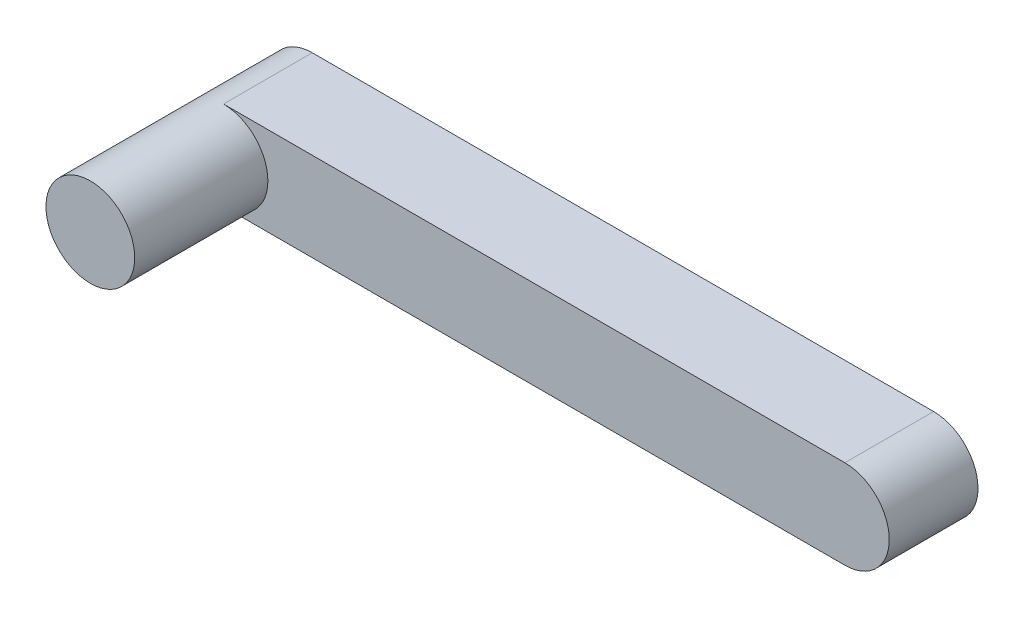
ISO-10303-21;
HEADER;
FILE_DESCRIPTION(('STEP AP214'),'2;1');
FILE_NAME('part.step','',(''),(''),'','','');
FILE_SCHEMA(('AUTOMOTIVE_DESIGN { 1 0 10303 214 1 1 1 1 }'));
ENDSEC;
DATA;
#1=APPLICATION_CONTEXT('core data for automotive mechanical design processes');
#2=APPLICATION_PROTOCOL_DEFINITION('international standard','automotive_design',2000,#1);
#3=PRODUCT_CONTEXT('',#1,'mechanical');
#4=PRODUCT('Part','Part','',(#3));
#5=PRODUCT_RELATED_PRODUCT_CATEGORY('part','',(#4));
#6=PRODUCT_DEFINITION_FORMATION('','',#4);
#7=PRODUCT_DEFINITION_CONTEXT('part definition',#1,'design');
#8=PRODUCT_DEFINITION('design','',#6,#7);
#9=PRODUCT_DEFINITION_SHAPE('','',#8);
#10=(LENGTH_UNIT() NAMED_UNIT(*) SI_UNIT(.MILLI.,.METRE.));
#11=(NAMED_UNIT(*) PLANE_ANGLE_UNIT() SI_UNIT($,.RADIAN.));
#12=(NAMED_UNIT(*) SI_UNIT($,.STERADIAN.) SOLID_ANGLE_UNIT());
#13=UNCERTAINTY_MEASURE_WITH_UNIT(LENGTH_MEASURE(1.E-05),#10,'distance_accuracy_value','');
#14=(GEOMETRIC_REPRESENTATION_CONTEXT(3) GLOBAL_UNCERTAINTY_ASSIGNED_CONTEXT((#13)) GLOBAL_UNIT_ASSIGNED_CONTEXT((#10,
#11,#12)) REPRESENTATION_CONTEXT('',''));
#15=CARTESIAN_POINT('',(0.,0.,0.));
#16=DIRECTION('',(0.,0.,1.));
#17=DIRECTION('',(1.,0.,0.));
#18=AXIS2_PLACEMENT_3D('',#15,#16,#17);
#19=CARTESIAN_POINT('',(0.,0.,25.4));
#20=DIRECTION('',(0.,0.,-1.));
#21=DIRECTION('',(-1.,0.,0.));
#22=AXIS2_PLACEMENT_3D('',#19,#20,#21);
#23=CYLINDRICAL_SURFACE('',#22,12.7);
#24=CARTESIAN_POINT('',(0.,0.,0.));
#25=DIRECTION('',(0.,0.,1.));
#26=DIRECTION('',(1.,0.,0.));
#27=AXIS2_PLACEMENT_3D('',#24,#25,#26);
#28=CIRCLE('',#27,12.7);
#29=CARTESIAN_POINT('',(0.,-12.7,0.));
#30=VERTEX_POINT('',#29);
#31=CARTESIAN_POINT('',(0.,12.7,0.));
#32=VERTEX_POINT('',#31);
#33=EDGE_CURVE('E118',#30,#32,#28,.T.);
#34=ORIENTED_EDGE('',*,*,#33,.T.);
#35=DIRECTION('',(0.,0.,-1.));
#36=VECTOR('',#35,1.);
#37=CARTESIAN_POINT('',(0.,12.7,25.4));
#38=LINE('',#37,#36);
#39=CARTESIAN_POINT('',(0.,12.7,25.4));
#40=VERTEX_POINT('',#39);
#41=EDGE_CURVE('E48',#40,#32,#38,.T.);
#42=ORIENTED_EDGE('',*,*,#41,.F.);
#43=CARTESIAN_POINT('',(0.,0.,25.4));
#44=DIRECTION('',(0.,0.,1.));
#45=DIRECTION('',(1.,0.,0.));
#46=AXIS2_PLACEMENT_3D('',#43,#44,#45);
#47=CIRCLE('',#46,12.7);
#48=CARTESIAN_POINT('',(0.,-12.7,25.4));
#49=VERTEX_POINT('',#48);
#50=EDGE_CURVE('E102',#49,#40,#47,.T.);
#51=ORIENTED_EDGE('',*,*,#50,.F.);
#52=DIRECTION('',(0.,0.,-1.));
#53=VECTOR('',#52,1.);
#54=CARTESIAN_POINT('',(0.,-12.7,25.4));
#55=LINE('',#54,#53);
#56=EDGE_CURVE('E109',#49,#30,#55,.T.);
#57=ORIENTED_EDGE('',*,*,#56,.T.);
#58=EDGE_LOOP('',(#34,#42,#51,#57));
#59=FACE_BOUND('',#58,.T.);
#60=ADVANCED_FACE('F45',(#59),#23,.T.);
#61=CARTESIAN_POINT('',(0.,12.7,25.4));
#62=DIRECTION('',(0.,-1.,0.));
#63=DIRECTION('',(1.,0.,0.));
#64=AXIS2_PLACEMENT_3D('',#61,#62,#63);
#65=PLANE('',#64);
#66=DIRECTION('',(-1.,0.,0.));
#67=VECTOR('',#66,1.);
#68=CARTESIAN_POINT('',(0.,12.7,0.));
#69=LINE('',#68,#67);
#70=CARTESIAN_POINT('',(-177.8,12.6999999999999,0.));
#71=VERTEX_POINT('',#70);
#72=EDGE_CURVE('E97',#32,#71,#69,.T.);
#73=ORIENTED_EDGE('',*,*,#72,.T.);
#74=DIRECTION('',(0.,0.,-1.));
#75=VECTOR('',#74,1.);
#76=CARTESIAN_POINT('',(-177.8,12.6999999999999,25.4));
#77=LINE('',#76,#75);
#78=CARTESIAN_POINT('',(-177.8,12.6999999999999,25.4));
#79=VERTEX_POINT('',#78);
#80=EDGE_CURVE('E95',#79,#71,#77,.T.);
#81=ORIENTED_EDGE('',*,*,#80,.F.);
#82=DIRECTION('',(-1.,0.,0.));
#83=VECTOR('',#82,1.);
#84=CARTESIAN_POINT('',(0.,12.7,25.4));
#85=LINE('',#84,#83);
#86=EDGE_CURVE('E93',#40,#79,#85,.T.);
#87=ORIENTED_EDGE('',*,*,#86,.F.);
#88=ORIENTED_EDGE('',*,*,#41,.T.);
#89=EDGE_LOOP('',(#73,#81,#87,#88));
#90=FACE_BOUND('',#89,.T.);
#91=ADVANCED_FACE('F96',(#90),#65,.F.);
#92=CARTESIAN_POINT('',(-177.8,0.,25.4));
#93=DIRECTION('',(0.,0.,-1.));
#94=DIRECTION('',(-1.,0.,0.));
#95=AXIS2_PLACEMENT_3D('',#92,#93,#94);
#96=CYLINDRICAL_SURFACE('',#95,12.7);
#97=CARTESIAN_POINT('',(-177.8,0.,0.));
#98=DIRECTION('',(0.,0.,1.));
#99=DIRECTION('',(1.,0.,0.));
#100=AXIS2_PLACEMENT_3D('',#97,#98,#99);
#101=CIRCLE('',#100,12.7);
#102=CARTESIAN_POINT('',(-177.8,-12.7,0.));
#103=VERTEX_POINT('',#102);
#104=EDGE_CURVE('E81',#71,#103,#101,.T.);
#105=ORIENTED_EDGE('',*,*,#104,.T.);
#106=DIRECTION('',(0.,0.,-1.));
#107=VECTOR('',#106,1.);
#108=CARTESIAN_POINT('',(-177.8,-12.7,25.4));
#109=LINE('',#108,#107);
#110=CARTESIAN_POINT('',(-177.8,-12.7,25.4));
#111=VERTEX_POINT('',#110);
#112=EDGE_CURVE('E99',#111,#103,#109,.T.);
#113=ORIENTED_EDGE('',*,*,#112,.F.);
#114=CARTESIAN_POINT('',(-177.8,0.,25.4));
#115=DIRECTION('',(0.,0.,1.));
#116=DIRECTION('',(1.,0.,0.));
#117=AXIS2_PLACEMENT_3D('',#114,#115,#116);
#118=CIRCLE('',#117,12.7);
#119=EDGE_CURVE('E11',#111,#79,#118,.T.);
#120=ORIENTED_EDGE('',*,*,#119,.T.);
#121=ORIENTED_EDGE('',*,*,#80,.T.);
#122=EDGE_LOOP('',(#105,#113,#120,#121));
#123=FACE_BOUND('',#122,.T.);
#124=CARTESIAN_POINT('',(-177.8,0.,63.5));
#125=DIRECTION('',(0.,0.,1.));
#126=DIRECTION('',(1.,0.,0.));
#127=AXIS2_PLACEMENT_3D('',#124,#125,#126);
#128=CIRCLE('',#127,12.7);
#129=CARTESIAN_POINT('',(-165.1,0.,63.5));
#130=VERTEX_POINT('',#129);
#131=EDGE_CURVE('E122',#130,#130,#128,.T.);
#132=ORIENTED_EDGE('',*,*,#131,.F.);
#133=EDGE_LOOP('',(#132));
#134=FACE_BOUND('',#133,.T.);
#135=ADVANCED_FACE('F106',(#123,#134),#96,.T.);
#136=CARTESIAN_POINT('',(0.,-12.7,25.4));
#137=DIRECTION('',(0.,1.,0.));
#138=DIRECTION('',(-1.,0.,0.));
#139=AXIS2_PLACEMENT_3D('',#136,#137,#138);
#140=PLANE('',#139);
#141=DIRECTION('',(1.,0.,0.));
#142=VECTOR('',#141,1.);
#143=CARTESIAN_POINT('',(0.,-12.7,0.));
#144=LINE('',#143,#142);
#145=EDGE_CURVE('E86',#103,#30,#144,.T.);
#146=ORIENTED_EDGE('',*,*,#145,.T.);
#147=ORIENTED_EDGE('',*,*,#56,.F.);
#148=DIRECTION('',(1.,0.,0.));
#149=VECTOR('',#148,1.);
#150=CARTESIAN_POINT('',(0.,-12.7,25.4));
#151=LINE('',#150,#149);
#152=EDGE_CURVE('E63',#111,#49,#151,.T.);
#153=ORIENTED_EDGE('',*,*,#152,.F.);
#154=ORIENTED_EDGE('',*,*,#112,.T.);
#155=EDGE_LOOP('',(#146,#147,#153,#154));
#156=FACE_BOUND('',#155,.T.);
#157=ADVANCED_FACE('F111',(#156),#140,.F.);
#158=CARTESIAN_POINT('',(0.,0.,25.4));
#159=DIRECTION('',(0.,0.,1.));
#160=DIRECTION('',(1.,0.,0.));
#161=AXIS2_PLACEMENT_3D('',#158,#159,#160);
#162=PLANE('',#161);
#163=ORIENTED_EDGE('',*,*,#119,.F.);
#164=ORIENTED_EDGE('',*,*,#152,.T.);
#165=ORIENTED_EDGE('',*,*,#50,.T.);
#166=ORIENTED_EDGE('',*,*,#86,.T.);
#167=EDGE_LOOP('',(#163,#164,#165,#166));
#168=FACE_BOUND('',#167,.T.);
#169=ADVANCED_FACE('F100',(#168),#162,.T.);
#170=CARTESIAN_POINT('',(0.,0.,0.));
#171=DIRECTION('',(0.,0.,1.));
#172=DIRECTION('',(1.,0.,0.));
#173=AXIS2_PLACEMENT_3D('',#170,#171,#172);
#174=PLANE('',#173);
#175=ORIENTED_EDGE('',*,*,#33,.F.);
#176=ORIENTED_EDGE('',*,*,#145,.F.);
#177=ORIENTED_EDGE('',*,*,#104,.F.);
#178=ORIENTED_EDGE('',*,*,#72,.F.);
#179=EDGE_LOOP('',(#175,#176,#177,#178));
#180=FACE_BOUND('',#179,.T.);
#181=ADVANCED_FACE('F149',(#180),#174,.F.);
#182=CARTESIAN_POINT('',(-177.8,0.,63.5));
#183=DIRECTION('',(0.,0.,1.));
#184=DIRECTION('',(1.,0.,0.));
#185=AXIS2_PLACEMENT_3D('',#182,#183,#184);
#186=PLANE('',#185);
#187=ORIENTED_EDGE('',*,*,#131,.T.);
#188=EDGE_LOOP('',(#187));
#189=FACE_BOUND('',#188,.T.);
#190=ADVANCED_FACE('F134',(#189),#186,.T.);
#191=CLOSED_SHELL('',(#60,#91,#135,#157,#169,#181,#190));
#192=MANIFOLD_SOLID_BREP('B2',#191);
#193=ADVANCED_BREP_SHAPE_REPRESENTATION('',(#18,#192),#14);
#194=SHAPE_DEFINITION_REPRESENTATION(#9,#193);
ENDSEC;
END-ISO-10303-21;
